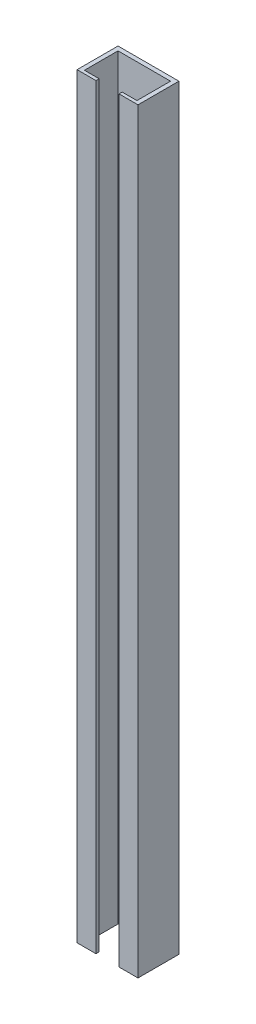
ISO-10303-21;
HEADER;
FILE_DESCRIPTION(('STEP AP214'),'2;1');
FILE_NAME('part.step','',(''),(''),'','','');
FILE_SCHEMA(('AUTOMOTIVE_DESIGN { 1 0 10303 214 1 1 1 1 }'));
ENDSEC;
DATA;
#1=APPLICATION_CONTEXT('core data for automotive mechanical design processes');
#2=APPLICATION_PROTOCOL_DEFINITION('international standard','automotive_design',2000,#1);
#3=PRODUCT_CONTEXT('',#1,'mechanical');
#4=PRODUCT('Part','Part','',(#3));
#5=PRODUCT_RELATED_PRODUCT_CATEGORY('part','',(#4));
#6=PRODUCT_DEFINITION_FORMATION('','',#4);
#7=PRODUCT_DEFINITION_CONTEXT('part definition',#1,'design');
#8=PRODUCT_DEFINITION('design','',#6,#7);
#9=PRODUCT_DEFINITION_SHAPE('','',#8);
#10=(LENGTH_UNIT() NAMED_UNIT(*) SI_UNIT(.MILLI.,.METRE.));
#11=(NAMED_UNIT(*) PLANE_ANGLE_UNIT() SI_UNIT($,.RADIAN.));
#12=(NAMED_UNIT(*) SI_UNIT($,.STERADIAN.) SOLID_ANGLE_UNIT());
#13=UNCERTAINTY_MEASURE_WITH_UNIT(LENGTH_MEASURE(1.E-05),#10,'distance_accuracy_value','');
#14=(GEOMETRIC_REPRESENTATION_CONTEXT(3) GLOBAL_UNCERTAINTY_ASSIGNED_CONTEXT((#13)) GLOBAL_UNIT_ASSIGNED_CONTEXT((#10,
#11,#12)) REPRESENTATION_CONTEXT('',''));
#15=CARTESIAN_POINT('',(0.,0.,0.));
#16=DIRECTION('',(0.,0.,1.));
#17=DIRECTION('',(1.,0.,0.));
#18=AXIS2_PLACEMENT_3D('',#15,#16,#17);
#19=CARTESIAN_POINT('',(-184.15,2286.,19.05));
#20=DIRECTION('',(1.,0.,0.));
#21=DIRECTION('',(0.,0.,-1.));
#22=AXIS2_PLACEMENT_3D('',#19,#20,#21);
#23=PLANE('',#22);
#24=DIRECTION('',(0.,0.,1.));
#25=VECTOR('',#24,1.);
#26=CARTESIAN_POINT('',(-184.15,-2286.,19.05));
#27=LINE('',#26,#25);
#28=CARTESIAN_POINT('',(-184.15,-2286.,-228.6));
#29=VERTEX_POINT('',#28);
#30=CARTESIAN_POINT('',(-184.15,-2286.,19.05));
#31=VERTEX_POINT('',#30);
#32=EDGE_CURVE('E168',#29,#31,#27,.T.);
#33=ORIENTED_EDGE('',*,*,#32,.T.);
#34=DIRECTION('',(0.,-1.,0.));
#35=VECTOR('',#34,1.);
#36=CARTESIAN_POINT('',(-184.15,2286.,19.05));
#37=LINE('',#36,#35);
#38=CARTESIAN_POINT('',(-184.15,2286.,19.05));
#39=VERTEX_POINT('',#38);
#40=EDGE_CURVE('E11',#39,#31,#37,.T.);
#41=ORIENTED_EDGE('',*,*,#40,.F.);
#42=DIRECTION('',(0.,0.,1.));
#43=VECTOR('',#42,1.);
#44=CARTESIAN_POINT('',(-184.15,2286.,19.05));
#45=LINE('',#44,#43);
#46=CARTESIAN_POINT('',(-184.15,2286.,-228.6));
#47=VERTEX_POINT('',#46);
#48=EDGE_CURVE('E202',#47,#39,#45,.T.);
#49=ORIENTED_EDGE('',*,*,#48,.F.);
#50=DIRECTION('',(0.,-1.,0.));
#51=VECTOR('',#50,1.);
#52=CARTESIAN_POINT('',(-184.15,2286.,-228.6));
#53=LINE('',#52,#51);
#54=EDGE_CURVE('E164',#47,#29,#53,.T.);
#55=ORIENTED_EDGE('',*,*,#54,.T.);
#56=EDGE_LOOP('',(#33,#41,#49,#55));
#57=FACE_BOUND('',#56,.T.);
#58=ADVANCED_FACE('F43',(#57),#23,.F.);
#59=CARTESIAN_POINT('',(-69.85,2286.,19.05));
#60=DIRECTION('',(0.,0.,-1.));
#61=DIRECTION('',(-1.,0.,0.));
#62=AXIS2_PLACEMENT_3D('',#59,#60,#61);
#63=PLANE('',#62);
#64=DIRECTION('',(1.,0.,0.));
#65=VECTOR('',#64,1.);
#66=CARTESIAN_POINT('',(-69.85,-2286.,19.05));
#67=LINE('',#66,#65);
#68=CARTESIAN_POINT('',(-69.85,-2286.,19.05));
#69=VERTEX_POINT('',#68);
#70=EDGE_CURVE('E172',#31,#69,#67,.T.);
#71=ORIENTED_EDGE('',*,*,#70,.T.);
#72=DIRECTION('',(0.,-1.,0.));
#73=VECTOR('',#72,1.);
#74=CARTESIAN_POINT('',(-69.85,2286.,19.05));
#75=LINE('',#74,#73);
#76=CARTESIAN_POINT('',(-69.85,2286.,19.05));
#77=VERTEX_POINT('',#76);
#78=EDGE_CURVE('E52',#77,#69,#75,.T.);
#79=ORIENTED_EDGE('',*,*,#78,.F.);
#80=DIRECTION('',(1.,0.,0.));
#81=VECTOR('',#80,1.);
#82=CARTESIAN_POINT('',(-69.85,2286.,19.05));
#83=LINE('',#82,#81);
#84=EDGE_CURVE('E115',#39,#77,#83,.T.);
#85=ORIENTED_EDGE('',*,*,#84,.F.);
#86=ORIENTED_EDGE('',*,*,#40,.T.);
#87=EDGE_LOOP('',(#71,#79,#85,#86));
#88=FACE_BOUND('',#87,.T.);
#89=ADVANCED_FACE('F296',(#88),#63,.F.);
#90=CARTESIAN_POINT('',(-69.85,2286.,0.));
#91=DIRECTION('',(-1.,0.,0.));
#92=DIRECTION('',(0.,0.,1.));
#93=AXIS2_PLACEMENT_3D('',#90,#91,#92);
#94=PLANE('',#93);
#95=DIRECTION('',(0.,0.,-1.));
#96=VECTOR('',#95,1.);
#97=CARTESIAN_POINT('',(-69.85,-2286.,0.));
#98=LINE('',#97,#96);
#99=CARTESIAN_POINT('',(-69.85,-2286.,0.));
#100=VERTEX_POINT('',#99);
#101=EDGE_CURVE('E175',#69,#100,#98,.T.);
#102=ORIENTED_EDGE('',*,*,#101,.T.);
#103=DIRECTION('',(0.,-1.,0.));
#104=VECTOR('',#103,1.);
#105=CARTESIAN_POINT('',(-69.85,2286.,0.));
#106=LINE('',#105,#104);
#107=CARTESIAN_POINT('',(-69.85,2286.,0.));
#108=VERTEX_POINT('',#107);
#109=EDGE_CURVE('E229',#108,#100,#106,.T.);
#110=ORIENTED_EDGE('',*,*,#109,.F.);
#111=DIRECTION('',(0.,0.,-1.));
#112=VECTOR('',#111,1.);
#113=CARTESIAN_POINT('',(-69.85,2286.,0.));
#114=LINE('',#113,#112);
#115=EDGE_CURVE('E239',#77,#108,#114,.T.);
#116=ORIENTED_EDGE('',*,*,#115,.F.);
#117=ORIENTED_EDGE('',*,*,#78,.T.);
#118=EDGE_LOOP('',(#102,#110,#116,#117));
#119=FACE_BOUND('',#118,.T.);
#120=ADVANCED_FACE('F237',(#119),#94,.F.);
#121=CARTESIAN_POINT('',(-158.75,2286.,0.));
#122=DIRECTION('',(0.,0.,1.));
#123=DIRECTION('',(1.,0.,0.));
#124=AXIS2_PLACEMENT_3D('',#121,#122,#123);
#125=PLANE('',#124);
#126=DIRECTION('',(-1.,0.,0.));
#127=VECTOR('',#126,1.);
#128=CARTESIAN_POINT('',(-158.75,-2286.,0.));
#129=LINE('',#128,#127);
#130=CARTESIAN_POINT('',(-158.75,-2286.,0.));
#131=VERTEX_POINT('',#130);
#132=EDGE_CURVE('E178',#100,#131,#129,.T.);
#133=ORIENTED_EDGE('',*,*,#132,.T.);
#134=DIRECTION('',(0.,-1.,0.));
#135=VECTOR('',#134,1.);
#136=CARTESIAN_POINT('',(-158.75,2286.,0.));
#137=LINE('',#136,#135);
#138=CARTESIAN_POINT('',(-158.75,2286.,0.));
#139=VERTEX_POINT('',#138);
#140=EDGE_CURVE('E225',#139,#131,#137,.T.);
#141=ORIENTED_EDGE('',*,*,#140,.F.);
#142=DIRECTION('',(-1.,0.,0.));
#143=VECTOR('',#142,1.);
#144=CARTESIAN_POINT('',(-158.75,2286.,0.));
#145=LINE('',#144,#143);
#146=EDGE_CURVE('E258',#108,#139,#145,.T.);
#147=ORIENTED_EDGE('',*,*,#146,.F.);
#148=ORIENTED_EDGE('',*,*,#109,.T.);
#149=EDGE_LOOP('',(#133,#141,#147,#148));
#150=FACE_BOUND('',#149,.T.);
#151=ADVANCED_FACE('F248',(#150),#125,.F.);
#152=CARTESIAN_POINT('',(-158.75,2286.,-203.2));
#153=DIRECTION('',(-1.,0.,0.));
#154=DIRECTION('',(0.,0.,1.));
#155=AXIS2_PLACEMENT_3D('',#152,#153,#154);
#156=PLANE('',#155);
#157=DIRECTION('',(0.,0.,-1.));
#158=VECTOR('',#157,1.);
#159=CARTESIAN_POINT('',(-158.75,-2286.,-203.2));
#160=LINE('',#159,#158);
#161=CARTESIAN_POINT('',(-158.75,-2286.,-203.2));
#162=VERTEX_POINT('',#161);
#163=EDGE_CURVE('E181',#131,#162,#160,.T.);
#164=ORIENTED_EDGE('',*,*,#163,.T.);
#165=DIRECTION('',(0.,-1.,0.));
#166=VECTOR('',#165,1.);
#167=CARTESIAN_POINT('',(-158.75,2286.,-203.2));
#168=LINE('',#167,#166);
#169=CARTESIAN_POINT('',(-158.75,2286.,-203.2));
#170=VERTEX_POINT('',#169);
#171=EDGE_CURVE('E221',#170,#162,#168,.T.);
#172=ORIENTED_EDGE('',*,*,#171,.F.);
#173=DIRECTION('',(0.,0.,-1.));
#174=VECTOR('',#173,1.);
#175=CARTESIAN_POINT('',(-158.75,2286.,-203.2));
#176=LINE('',#175,#174);
#177=EDGE_CURVE('E254',#139,#170,#176,.T.);
#178=ORIENTED_EDGE('',*,*,#177,.F.);
#179=ORIENTED_EDGE('',*,*,#140,.T.);
#180=EDGE_LOOP('',(#164,#172,#178,#179));
#181=FACE_BOUND('',#180,.T.);
#182=ADVANCED_FACE('F252',(#181),#156,.F.);
#183=CARTESIAN_POINT('',(158.75,2286.,-203.2));
#184=DIRECTION('',(0.,0.,-1.));
#185=DIRECTION('',(-1.,0.,0.));
#186=AXIS2_PLACEMENT_3D('',#183,#184,#185);
#187=PLANE('',#186);
#188=DIRECTION('',(1.,0.,0.));
#189=VECTOR('',#188,1.);
#190=CARTESIAN_POINT('',(158.75,-2286.,-203.2));
#191=LINE('',#190,#189);
#192=CARTESIAN_POINT('',(158.75,-2286.,-203.2));
#193=VERTEX_POINT('',#192);
#194=EDGE_CURVE('E184',#162,#193,#191,.T.);
#195=ORIENTED_EDGE('',*,*,#194,.T.);
#196=DIRECTION('',(0.,-1.,0.));
#197=VECTOR('',#196,1.);
#198=CARTESIAN_POINT('',(158.75,2286.,-203.2));
#199=LINE('',#198,#197);
#200=CARTESIAN_POINT('',(158.75,2286.,-203.2));
#201=VERTEX_POINT('',#200);
#202=EDGE_CURVE('E217',#201,#193,#199,.T.);
#203=ORIENTED_EDGE('',*,*,#202,.F.);
#204=DIRECTION('',(1.,0.,0.));
#205=VECTOR('',#204,1.);
#206=CARTESIAN_POINT('',(158.75,2286.,-203.2));
#207=LINE('',#206,#205);
#208=EDGE_CURVE('E257',#170,#201,#207,.T.);
#209=ORIENTED_EDGE('',*,*,#208,.F.);
#210=ORIENTED_EDGE('',*,*,#171,.T.);
#211=EDGE_LOOP('',(#195,#203,#209,#210));
#212=FACE_BOUND('',#211,.T.);
#213=ADVANCED_FACE('F309',(#212),#187,.F.);
#214=CARTESIAN_POINT('',(158.75,2286.,0.));
#215=DIRECTION('',(1.,0.,0.));
#216=DIRECTION('',(0.,0.,-1.));
#217=AXIS2_PLACEMENT_3D('',#214,#215,#216);
#218=PLANE('',#217);
#219=DIRECTION('',(0.,0.,1.));
#220=VECTOR('',#219,1.);
#221=CARTESIAN_POINT('',(158.75,-2286.,0.));
#222=LINE('',#221,#220);
#223=CARTESIAN_POINT('',(158.75,-2286.,0.));
#224=VERTEX_POINT('',#223);
#225=EDGE_CURVE('E187',#193,#224,#222,.T.);
#226=ORIENTED_EDGE('',*,*,#225,.T.);
#227=DIRECTION('',(0.,-1.,0.));
#228=VECTOR('',#227,1.);
#229=CARTESIAN_POINT('',(158.75,2286.,0.));
#230=LINE('',#229,#228);
#231=CARTESIAN_POINT('',(158.75,2286.,0.));
#232=VERTEX_POINT('',#231);
#233=EDGE_CURVE('E213',#232,#224,#230,.T.);
#234=ORIENTED_EDGE('',*,*,#233,.F.);
#235=DIRECTION('',(0.,0.,1.));
#236=VECTOR('',#235,1.);
#237=CARTESIAN_POINT('',(158.75,2286.,0.));
#238=LINE('',#237,#236);
#239=EDGE_CURVE('E262',#201,#232,#238,.T.);
#240=ORIENTED_EDGE('',*,*,#239,.F.);
#241=ORIENTED_EDGE('',*,*,#202,.T.);
#242=EDGE_LOOP('',(#226,#234,#240,#241));
#243=FACE_BOUND('',#242,.T.);
#244=ADVANCED_FACE('F312',(#243),#218,.F.);
#245=CARTESIAN_POINT('',(69.85,2286.,0.));
#246=DIRECTION('',(0.,0.,1.));
#247=DIRECTION('',(1.,0.,0.));
#248=AXIS2_PLACEMENT_3D('',#245,#246,#247);
#249=PLANE('',#248);
#250=DIRECTION('',(-1.,0.,0.));
#251=VECTOR('',#250,1.);
#252=CARTESIAN_POINT('',(69.85,-2286.,0.));
#253=LINE('',#252,#251);
#254=CARTESIAN_POINT('',(69.85,-2286.,0.));
#255=VERTEX_POINT('',#254);
#256=EDGE_CURVE('E190',#224,#255,#253,.T.);
#257=ORIENTED_EDGE('',*,*,#256,.T.);
#258=DIRECTION('',(0.,-1.,0.));
#259=VECTOR('',#258,1.);
#260=CARTESIAN_POINT('',(69.85,2286.,0.));
#261=LINE('',#260,#259);
#262=CARTESIAN_POINT('',(69.85,2286.,0.));
#263=VERTEX_POINT('',#262);
#264=EDGE_CURVE('E209',#263,#255,#261,.T.);
#265=ORIENTED_EDGE('',*,*,#264,.F.);
#266=DIRECTION('',(-1.,0.,0.));
#267=VECTOR('',#266,1.);
#268=CARTESIAN_POINT('',(69.85,2286.,0.));
#269=LINE('',#268,#267);
#270=EDGE_CURVE('E269',#232,#263,#269,.T.);
#271=ORIENTED_EDGE('',*,*,#270,.F.);
#272=ORIENTED_EDGE('',*,*,#233,.T.);
#273=EDGE_LOOP('',(#257,#265,#271,#272));
#274=FACE_BOUND('',#273,.T.);
#275=ADVANCED_FACE('F277',(#274),#249,.F.);
#276=CARTESIAN_POINT('',(69.85,2286.,19.05));
#277=DIRECTION('',(1.,0.,0.));
#278=DIRECTION('',(0.,0.,-1.));
#279=AXIS2_PLACEMENT_3D('',#276,#277,#278);
#280=PLANE('',#279);
#281=DIRECTION('',(0.,0.,1.));
#282=VECTOR('',#281,1.);
#283=CARTESIAN_POINT('',(69.85,-2286.,19.05));
#284=LINE('',#283,#282);
#285=CARTESIAN_POINT('',(69.85,-2286.,19.05));
#286=VERTEX_POINT('',#285);
#287=EDGE_CURVE('E193',#255,#286,#284,.T.);
#288=ORIENTED_EDGE('',*,*,#287,.T.);
#289=DIRECTION('',(0.,-1.,0.));
#290=VECTOR('',#289,1.);
#291=CARTESIAN_POINT('',(69.85,2286.,19.05));
#292=LINE('',#291,#290);
#293=CARTESIAN_POINT('',(69.85,2286.,19.05));
#294=VERTEX_POINT('',#293);
#295=EDGE_CURVE('E157',#294,#286,#292,.T.);
#296=ORIENTED_EDGE('',*,*,#295,.F.);
#297=DIRECTION('',(0.,0.,1.));
#298=VECTOR('',#297,1.);
#299=CARTESIAN_POINT('',(69.85,2286.,19.05));
#300=LINE('',#299,#298);
#301=EDGE_CURVE('E146',#263,#294,#300,.T.);
#302=ORIENTED_EDGE('',*,*,#301,.F.);
#303=ORIENTED_EDGE('',*,*,#264,.T.);
#304=EDGE_LOOP('',(#288,#296,#302,#303));
#305=FACE_BOUND('',#304,.T.);
#306=ADVANCED_FACE('F281',(#305),#280,.F.);
#307=CARTESIAN_POINT('',(184.15,2286.,19.05));
#308=DIRECTION('',(0.,0.,-1.));
#309=DIRECTION('',(-1.,0.,0.));
#310=AXIS2_PLACEMENT_3D('',#307,#308,#309);
#311=PLANE('',#310);
#312=DIRECTION('',(1.,0.,0.));
#313=VECTOR('',#312,1.);
#314=CARTESIAN_POINT('',(184.15,-2286.,19.05));
#315=LINE('',#314,#313);
#316=CARTESIAN_POINT('',(184.15,-2286.,19.05));
#317=VERTEX_POINT('',#316);
#318=EDGE_CURVE('E155',#286,#317,#315,.T.);
#319=ORIENTED_EDGE('',*,*,#318,.T.);
#320=DIRECTION('',(0.,-1.,0.));
#321=VECTOR('',#320,1.);
#322=CARTESIAN_POINT('',(184.15,2286.,19.05));
#323=LINE('',#322,#321);
#324=CARTESIAN_POINT('',(184.15,2286.,19.05));
#325=VERTEX_POINT('',#324);
#326=EDGE_CURVE('E152',#325,#317,#323,.T.);
#327=ORIENTED_EDGE('',*,*,#326,.F.);
#328=DIRECTION('',(1.,0.,0.));
#329=VECTOR('',#328,1.);
#330=CARTESIAN_POINT('',(184.15,2286.,19.05));
#331=LINE('',#330,#329);
#332=EDGE_CURVE('E140',#294,#325,#331,.T.);
#333=ORIENTED_EDGE('',*,*,#332,.F.);
#334=ORIENTED_EDGE('',*,*,#295,.T.);
#335=EDGE_LOOP('',(#319,#327,#333,#334));
#336=FACE_BOUND('',#335,.T.);
#337=ADVANCED_FACE('F153',(#336),#311,.F.);
#338=CARTESIAN_POINT('',(184.15,2286.,-228.6));
#339=DIRECTION('',(-1.,0.,0.));
#340=DIRECTION('',(0.,0.,1.));
#341=AXIS2_PLACEMENT_3D('',#338,#339,#340);
#342=PLANE('',#341);
#343=DIRECTION('',(0.,0.,-1.));
#344=VECTOR('',#343,1.);
#345=CARTESIAN_POINT('',(184.15,-2286.,-228.6));
#346=LINE('',#345,#344);
#347=CARTESIAN_POINT('',(184.15,-2286.,-228.6));
#348=VERTEX_POINT('',#347);
#349=EDGE_CURVE('E101',#317,#348,#346,.T.);
#350=ORIENTED_EDGE('',*,*,#349,.T.);
#351=DIRECTION('',(0.,-1.,0.));
#352=VECTOR('',#351,1.);
#353=CARTESIAN_POINT('',(184.15,2286.,-228.6));
#354=LINE('',#353,#352);
#355=CARTESIAN_POINT('',(184.15,2286.,-228.6));
#356=VERTEX_POINT('',#355);
#357=EDGE_CURVE('E158',#356,#348,#354,.T.);
#358=ORIENTED_EDGE('',*,*,#357,.F.);
#359=DIRECTION('',(0.,0.,-1.));
#360=VECTOR('',#359,1.);
#361=CARTESIAN_POINT('',(184.15,2286.,-228.6));
#362=LINE('',#361,#360);
#363=EDGE_CURVE('E144',#325,#356,#362,.T.);
#364=ORIENTED_EDGE('',*,*,#363,.F.);
#365=ORIENTED_EDGE('',*,*,#326,.T.);
#366=EDGE_LOOP('',(#350,#358,#364,#365));
#367=FACE_BOUND('',#366,.T.);
#368=ADVANCED_FACE('F160',(#367),#342,.F.);
#369=CARTESIAN_POINT('',(-184.15,2286.,-228.6));
#370=DIRECTION('',(0.,0.,1.));
#371=DIRECTION('',(1.,0.,0.));
#372=AXIS2_PLACEMENT_3D('',#369,#370,#371);
#373=PLANE('',#372);
#374=DIRECTION('',(-1.,0.,0.));
#375=VECTOR('',#374,1.);
#376=CARTESIAN_POINT('',(-184.15,-2286.,-228.6));
#377=LINE('',#376,#375);
#378=EDGE_CURVE('E107',#348,#29,#377,.T.);
#379=ORIENTED_EDGE('',*,*,#378,.T.);
#380=ORIENTED_EDGE('',*,*,#54,.F.);
#381=DIRECTION('',(-1.,0.,0.));
#382=VECTOR('',#381,1.);
#383=CARTESIAN_POINT('',(-184.15,2286.,-228.6));
#384=LINE('',#383,#382);
#385=EDGE_CURVE('E60',#356,#47,#384,.T.);
#386=ORIENTED_EDGE('',*,*,#385,.F.);
#387=ORIENTED_EDGE('',*,*,#357,.T.);
#388=EDGE_LOOP('',(#379,#380,#386,#387));
#389=FACE_BOUND('',#388,.T.);
#390=ADVANCED_FACE('F285',(#389),#373,.F.);
#391=CARTESIAN_POINT('',(0.,2286.,0.));
#392=DIRECTION('',(0.,-1.,0.));
#393=DIRECTION('',(0.,0.,-1.));
#394=AXIS2_PLACEMENT_3D('',#391,#392,#393);
#395=PLANE('',#394);
#396=ORIENTED_EDGE('',*,*,#48,.T.);
#397=ORIENTED_EDGE('',*,*,#84,.T.);
#398=ORIENTED_EDGE('',*,*,#115,.T.);
#399=ORIENTED_EDGE('',*,*,#146,.T.);
#400=ORIENTED_EDGE('',*,*,#177,.T.);
#401=ORIENTED_EDGE('',*,*,#208,.T.);
#402=ORIENTED_EDGE('',*,*,#239,.T.);
#403=ORIENTED_EDGE('',*,*,#270,.T.);
#404=ORIENTED_EDGE('',*,*,#301,.T.);
#405=ORIENTED_EDGE('',*,*,#332,.T.);
#406=ORIENTED_EDGE('',*,*,#363,.T.);
#407=ORIENTED_EDGE('',*,*,#385,.T.);
#408=EDGE_LOOP('',(#396,#397,#398,#399,#400,#401,#402,#403,#404,#405,#406,#407));
#409=FACE_BOUND('',#408,.T.);
#410=ADVANCED_FACE('F142',(#409),#395,.F.);
#411=CARTESIAN_POINT('',(0.,-2286.,0.));
#412=DIRECTION('',(0.,-1.,0.));
#413=DIRECTION('',(0.,0.,-1.));
#414=AXIS2_PLACEMENT_3D('',#411,#412,#413);
#415=PLANE('',#414);
#416=ORIENTED_EDGE('',*,*,#32,.F.);
#417=ORIENTED_EDGE('',*,*,#378,.F.);
#418=ORIENTED_EDGE('',*,*,#349,.F.);
#419=ORIENTED_EDGE('',*,*,#318,.F.);
#420=ORIENTED_EDGE('',*,*,#287,.F.);
#421=ORIENTED_EDGE('',*,*,#256,.F.);
#422=ORIENTED_EDGE('',*,*,#225,.F.);
#423=ORIENTED_EDGE('',*,*,#194,.F.);
#424=ORIENTED_EDGE('',*,*,#163,.F.);
#425=ORIENTED_EDGE('',*,*,#132,.F.);
#426=ORIENTED_EDGE('',*,*,#101,.F.);
#427=ORIENTED_EDGE('',*,*,#70,.F.);
#428=EDGE_LOOP('',(#416,#417,#418,#419,#420,#421,#422,#423,#424,#425,#426,#427));
#429=FACE_BOUND('',#428,.T.);
#430=ADVANCED_FACE('F243',(#429),#415,.T.);
#431=CLOSED_SHELL('',(#58,#89,#120,#151,#182,#213,#244,#275,#306,#337,#368,#390,#410,#430));
#432=MANIFOLD_SOLID_BREP('B2',#431);
#433=ADVANCED_BREP_SHAPE_REPRESENTATION('',(#18,#432),#14);
#434=SHAPE_DEFINITION_REPRESENTATION(#9,#433);
ENDSEC;
END-ISO-10303-21;
